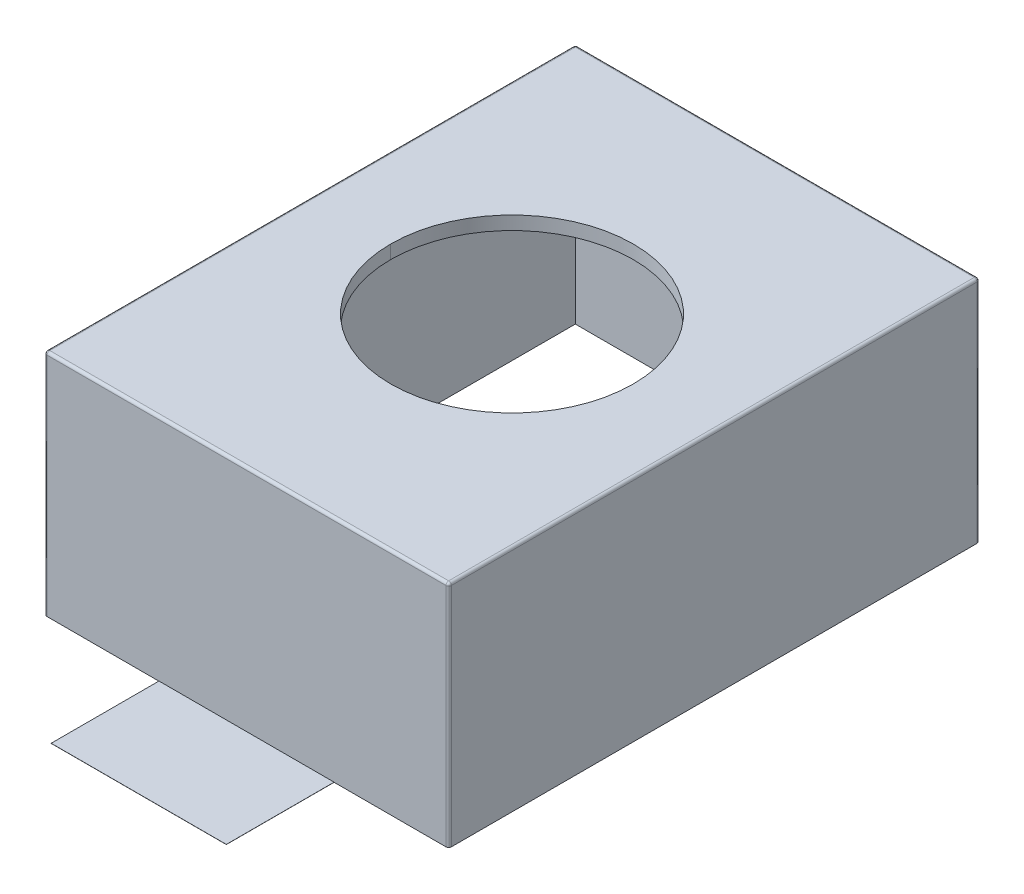
ISO-10303-21;
HEADER;
FILE_DESCRIPTION(('STEP AP214'),'2;1');
FILE_NAME('part.step','',(''),(''),'','','');
FILE_SCHEMA(('AUTOMOTIVE_DESIGN { 1 0 10303 214 1 1 1 1 }'));
ENDSEC;
DATA;
#1=APPLICATION_CONTEXT('core data for automotive mechanical design processes');
#2=APPLICATION_PROTOCOL_DEFINITION('international standard','automotive_design',2000,#1);
#3=PRODUCT_CONTEXT('',#1,'mechanical');
#4=PRODUCT('Part','Part','',(#3));
#5=PRODUCT_RELATED_PRODUCT_CATEGORY('part','',(#4));
#6=PRODUCT_DEFINITION_FORMATION('','',#4);
#7=PRODUCT_DEFINITION_CONTEXT('part definition',#1,'design');
#8=PRODUCT_DEFINITION('design','',#6,#7);
#9=PRODUCT_DEFINITION_SHAPE('','',#8);
#10=(LENGTH_UNIT() NAMED_UNIT(*) SI_UNIT(.MILLI.,.METRE.));
#11=(NAMED_UNIT(*) PLANE_ANGLE_UNIT() SI_UNIT($,.RADIAN.));
#12=(NAMED_UNIT(*) SI_UNIT($,.STERADIAN.) SOLID_ANGLE_UNIT());
#13=UNCERTAINTY_MEASURE_WITH_UNIT(LENGTH_MEASURE(1.E-05),#10,'distance_accuracy_value','');
#14=(GEOMETRIC_REPRESENTATION_CONTEXT(3) GLOBAL_UNCERTAINTY_ASSIGNED_CONTEXT((#13)) GLOBAL_UNIT_ASSIGNED_CONTEXT((#10,
#11,#12)) REPRESENTATION_CONTEXT('',''));
#15=CARTESIAN_POINT('',(0.,0.,0.));
#16=DIRECTION('',(0.,0.,1.));
#17=DIRECTION('',(1.,0.,0.));
#18=AXIS2_PLACEMENT_3D('',#15,#16,#17);
#19=CARTESIAN_POINT('',(6.25,1.651,18.66));
#20=DIRECTION('',(0.,-1.,0.));
#21=DIRECTION('',(0.,0.,-1.));
#22=AXIS2_PLACEMENT_3D('',#19,#20,#21);
#23=PLANE('',#22);
#24=DIRECTION('',(0.,0.,1.));
#25=VECTOR('',#24,1.);
#26=CARTESIAN_POINT('',(5.6,1.651,23.));
#27=LINE('',#26,#25);
#28=CARTESIAN_POINT('',(5.6,1.651,23.));
#29=VERTEX_POINT('',#28);
#30=CARTESIAN_POINT('',(5.6,1.651,23.8));
#31=VERTEX_POINT('',#30);
#32=EDGE_CURVE('E11',#29,#31,#27,.T.);
#33=ORIENTED_EDGE('',*,*,#32,.T.);
#34=DIRECTION('',(1.,0.,0.));
#35=VECTOR('',#34,1.);
#36=CARTESIAN_POINT('',(5.6,1.651,23.8));
#37=LINE('',#36,#35);
#38=CARTESIAN_POINT('',(6.9,1.651,23.8));
#39=VERTEX_POINT('',#38);
#40=EDGE_CURVE('E44',#31,#39,#37,.T.);
#41=ORIENTED_EDGE('',*,*,#40,.T.);
#42=DIRECTION('',(0.,0.,-1.));
#43=VECTOR('',#42,1.);
#44=CARTESIAN_POINT('',(6.9,1.651,23.8));
#45=LINE('',#44,#43);
#46=CARTESIAN_POINT('',(6.9,1.651,23.));
#47=VERTEX_POINT('',#46);
#48=EDGE_CURVE('E20',#39,#47,#45,.T.);
#49=ORIENTED_EDGE('',*,*,#48,.T.);
#50=DIRECTION('',(1.,0.,0.));
#51=VECTOR('',#50,1.);
#52=CARTESIAN_POINT('',(5.6,1.651,23.));
#53=LINE('',#52,#51);
#54=EDGE_CURVE('E466',#29,#47,#53,.T.);
#55=ORIENTED_EDGE('',*,*,#54,.F.);
#56=EDGE_LOOP('',(#33,#41,#49,#55));
#57=FACE_BOUND('',#56,.T.);
#58=ADVANCED_FACE('F17',(#57),#23,.F.);
#59=CARTESIAN_POINT('',(5.6,1.65,23.));
#60=DIRECTION('',(-1.,0.,0.));
#61=DIRECTION('',(0.,0.,1.));
#62=AXIS2_PLACEMENT_3D('',#59,#60,#61);
#63=PLANE('',#62);
#64=DIRECTION('',(0.,1.,0.));
#65=VECTOR('',#64,1.);
#66=CARTESIAN_POINT('',(5.6,1.65,23.8));
#67=LINE('',#66,#65);
#68=CARTESIAN_POINT('',(5.6,1.65,23.8));
#69=VERTEX_POINT('',#68);
#70=EDGE_CURVE('E26',#69,#31,#67,.T.);
#71=ORIENTED_EDGE('',*,*,#70,.T.);
#72=ORIENTED_EDGE('',*,*,#32,.F.);
#73=DIRECTION('',(0.,1.,0.));
#74=VECTOR('',#73,1.);
#75=CARTESIAN_POINT('',(5.6,1.65,23.));
#76=LINE('',#75,#74);
#77=CARTESIAN_POINT('',(5.6,1.65,23.));
#78=VERTEX_POINT('',#77);
#79=EDGE_CURVE('E430',#78,#29,#76,.T.);
#80=ORIENTED_EDGE('',*,*,#79,.F.);
#81=DIRECTION('',(0.,0.,1.));
#82=VECTOR('',#81,1.);
#83=CARTESIAN_POINT('',(5.6,1.65,23.));
#84=LINE('',#83,#82);
#85=EDGE_CURVE('E507',#78,#69,#84,.T.);
#86=ORIENTED_EDGE('',*,*,#85,.T.);
#87=EDGE_LOOP('',(#71,#72,#80,#86));
#88=FACE_BOUND('',#87,.T.);
#89=ADVANCED_FACE('F654',(#88),#63,.T.);
#90=CARTESIAN_POINT('',(5.6,1.65,23.8));
#91=DIRECTION('',(0.,0.,1.));
#92=DIRECTION('',(1.,0.,0.));
#93=AXIS2_PLACEMENT_3D('',#90,#91,#92);
#94=PLANE('',#93);
#95=DIRECTION('',(0.,1.,0.));
#96=VECTOR('',#95,1.);
#97=CARTESIAN_POINT('',(6.9,1.65,23.8));
#98=LINE('',#97,#96);
#99=CARTESIAN_POINT('',(6.9,1.65,23.8));
#100=VERTEX_POINT('',#99);
#101=EDGE_CURVE('E383',#100,#39,#98,.T.);
#102=ORIENTED_EDGE('',*,*,#101,.T.);
#103=ORIENTED_EDGE('',*,*,#40,.F.);
#104=ORIENTED_EDGE('',*,*,#70,.F.);
#105=DIRECTION('',(1.,0.,0.));
#106=VECTOR('',#105,1.);
#107=CARTESIAN_POINT('',(5.6,1.65,23.8));
#108=LINE('',#107,#106);
#109=EDGE_CURVE('E503',#69,#100,#108,.T.);
#110=ORIENTED_EDGE('',*,*,#109,.T.);
#111=EDGE_LOOP('',(#102,#103,#104,#110));
#112=FACE_BOUND('',#111,.T.);
#113=ADVANCED_FACE('F657',(#112),#94,.T.);
#114=CARTESIAN_POINT('',(6.9,1.65,23.8));
#115=DIRECTION('',(1.,0.,0.));
#116=DIRECTION('',(0.,1.,0.));
#117=AXIS2_PLACEMENT_3D('',#114,#115,#116);
#118=PLANE('',#117);
#119=DIRECTION('',(0.,-1.,0.));
#120=VECTOR('',#119,1.);
#121=CARTESIAN_POINT('',(6.9,1.651,23.));
#122=LINE('',#121,#120);
#123=CARTESIAN_POINT('',(6.9,1.65,23.));
#124=VERTEX_POINT('',#123);
#125=EDGE_CURVE('E425',#47,#124,#122,.T.);
#126=ORIENTED_EDGE('',*,*,#125,.F.);
#127=ORIENTED_EDGE('',*,*,#48,.F.);
#128=ORIENTED_EDGE('',*,*,#101,.F.);
#129=DIRECTION('',(0.,0.,-1.));
#130=VECTOR('',#129,1.);
#131=CARTESIAN_POINT('',(6.9,1.65,23.8));
#132=LINE('',#131,#130);
#133=EDGE_CURVE('E495',#100,#124,#132,.T.);
#134=ORIENTED_EDGE('',*,*,#133,.T.);
#135=EDGE_LOOP('',(#126,#127,#128,#134));
#136=FACE_BOUND('',#135,.T.);
#137=ADVANCED_FACE('F647',(#136),#118,.T.);
#138=CARTESIAN_POINT('',(4.85,1.65,19.06));
#139=DIRECTION('',(-1.,0.,0.));
#140=DIRECTION('',(0.,0.,1.));
#141=AXIS2_PLACEMENT_3D('',#138,#139,#140);
#142=PLANE('',#141);
#143=DIRECTION('',(0.,0.,1.));
#144=VECTOR('',#143,1.);
#145=CARTESIAN_POINT('',(4.85,1.65,19.16));
#146=LINE('',#145,#144);
#147=CARTESIAN_POINT('',(4.85,1.65,19.16));
#148=VERTEX_POINT('',#147);
#149=CARTESIAN_POINT('',(4.85,1.65,22.9));
#150=VERTEX_POINT('',#149);
#151=EDGE_CURVE('E519',#148,#150,#146,.T.);
#152=ORIENTED_EDGE('',*,*,#151,.F.);
#153=DIRECTION('',(0.,1.,0.));
#154=VECTOR('',#153,1.);
#155=CARTESIAN_POINT('',(4.85,1.65,19.16));
#156=LINE('',#155,#154);
#157=CARTESIAN_POINT('',(4.85,3.25,19.16));
#158=VERTEX_POINT('',#157);
#159=EDGE_CURVE('E636',#148,#158,#156,.T.);
#160=ORIENTED_EDGE('',*,*,#159,.T.);
#161=DIRECTION('',(0.,0.,1.));
#162=VECTOR('',#161,1.);
#163=CARTESIAN_POINT('',(4.85,3.25,19.16));
#164=LINE('',#163,#162);
#165=CARTESIAN_POINT('',(4.85,3.25,22.9));
#166=VERTEX_POINT('',#165);
#167=EDGE_CURVE('E482',#158,#166,#164,.T.);
#168=ORIENTED_EDGE('',*,*,#167,.T.);
#169=DIRECTION('',(0.,1.,0.));
#170=VECTOR('',#169,1.);
#171=CARTESIAN_POINT('',(4.85,1.65,22.9));
#172=LINE('',#171,#170);
#173=EDGE_CURVE('E404',#150,#166,#172,.T.);
#174=ORIENTED_EDGE('',*,*,#173,.F.);
#175=EDGE_LOOP('',(#152,#160,#168,#174));
#176=FACE_BOUND('',#175,.T.);
#177=ADVANCED_FACE('F753',(#176),#142,.F.);
#178=CARTESIAN_POINT('',(7.75,1.65,19.16));
#179=DIRECTION('',(0.,0.,-1.));
#180=DIRECTION('',(0.,-1.,0.));
#181=AXIS2_PLACEMENT_3D('',#178,#179,#180);
#182=PLANE('',#181);
#183=DIRECTION('',(0.,1.,0.));
#184=VECTOR('',#183,1.);
#185=CARTESIAN_POINT('',(7.65,1.65,19.16));
#186=LINE('',#185,#184);
#187=CARTESIAN_POINT('',(7.65,1.65,19.16));
#188=VERTEX_POINT('',#187);
#189=CARTESIAN_POINT('',(7.65,3.25,19.16));
#190=VERTEX_POINT('',#189);
#191=EDGE_CURVE('E403',#188,#190,#186,.T.);
#192=ORIENTED_EDGE('',*,*,#191,.T.);
#193=DIRECTION('',(-1.,0.,0.));
#194=VECTOR('',#193,1.);
#195=CARTESIAN_POINT('',(7.65,3.25,19.16));
#196=LINE('',#195,#194);
#197=EDGE_CURVE('E477',#190,#158,#196,.T.);
#198=ORIENTED_EDGE('',*,*,#197,.T.);
#199=ORIENTED_EDGE('',*,*,#159,.F.);
#200=DIRECTION('',(-1.,0.,0.));
#201=VECTOR('',#200,1.);
#202=CARTESIAN_POINT('',(7.65,1.65,19.16));
#203=LINE('',#202,#201);
#204=EDGE_CURVE('E426',#188,#148,#203,.T.);
#205=ORIENTED_EDGE('',*,*,#204,.F.);
#206=EDGE_LOOP('',(#192,#198,#199,#205));
#207=FACE_BOUND('',#206,.T.);
#208=ADVANCED_FACE('F756',(#207),#182,.F.);
#209=CARTESIAN_POINT('',(7.65,1.65,23.));
#210=DIRECTION('',(1.,0.,0.));
#211=DIRECTION('',(0.,1.,0.));
#212=AXIS2_PLACEMENT_3D('',#209,#210,#211);
#213=PLANE('',#212);
#214=DIRECTION('',(0.,0.,-1.));
#215=VECTOR('',#214,1.);
#216=CARTESIAN_POINT('',(7.65,1.65,22.9));
#217=LINE('',#216,#215);
#218=CARTESIAN_POINT('',(7.65,1.65,22.9));
#219=VERTEX_POINT('',#218);
#220=EDGE_CURVE('E431',#219,#188,#217,.T.);
#221=ORIENTED_EDGE('',*,*,#220,.F.);
#222=DIRECTION('',(0.,1.,0.));
#223=VECTOR('',#222,1.);
#224=CARTESIAN_POINT('',(7.65,1.65,22.9));
#225=LINE('',#224,#223);
#226=CARTESIAN_POINT('',(7.65,3.25,22.9));
#227=VERTEX_POINT('',#226);
#228=EDGE_CURVE('E400',#219,#227,#225,.T.);
#229=ORIENTED_EDGE('',*,*,#228,.T.);
#230=DIRECTION('',(0.,0.,-1.));
#231=VECTOR('',#230,1.);
#232=CARTESIAN_POINT('',(7.65,3.25,22.9));
#233=LINE('',#232,#231);
#234=EDGE_CURVE('E481',#227,#190,#233,.T.);
#235=ORIENTED_EDGE('',*,*,#234,.T.);
#236=ORIENTED_EDGE('',*,*,#191,.F.);
#237=EDGE_LOOP('',(#221,#229,#235,#236));
#238=FACE_BOUND('',#237,.T.);
#239=ADVANCED_FACE('F759',(#238),#213,.F.);
#240=CARTESIAN_POINT('',(4.75,1.65,22.9));
#241=DIRECTION('',(0.,0.,1.));
#242=DIRECTION('',(1.,0.,0.));
#243=AXIS2_PLACEMENT_3D('',#240,#241,#242);
#244=PLANE('',#243);
#245=ORIENTED_EDGE('',*,*,#173,.T.);
#246=DIRECTION('',(1.,0.,0.));
#247=VECTOR('',#246,1.);
#248=CARTESIAN_POINT('',(4.85,3.25,22.9));
#249=LINE('',#248,#247);
#250=EDGE_CURVE('E496',#166,#227,#249,.T.);
#251=ORIENTED_EDGE('',*,*,#250,.T.);
#252=ORIENTED_EDGE('',*,*,#228,.F.);
#253=DIRECTION('',(1.,0.,0.));
#254=VECTOR('',#253,1.);
#255=CARTESIAN_POINT('',(4.85,1.65,22.9));
#256=LINE('',#255,#254);
#257=EDGE_CURVE('E523',#150,#219,#256,.T.);
#258=ORIENTED_EDGE('',*,*,#257,.F.);
#259=EDGE_LOOP('',(#245,#251,#252,#258));
#260=FACE_BOUND('',#259,.T.);
#261=ADVANCED_FACE('F761',(#260),#244,.F.);
#262=CARTESIAN_POINT('',(6.25,3.25,21.03));
#263=DIRECTION('',(0.,1.,0.));
#264=DIRECTION('',(1.,0.,0.));
#265=AXIS2_PLACEMENT_3D('',#262,#263,#264);
#266=PLANE('',#265);
#267=CARTESIAN_POINT('',(6.25,3.25,21.03));
#268=DIRECTION('',(0.,-1.,0.));
#269=DIRECTION('',(1.,0.,0.));
#270=AXIS2_PLACEMENT_3D('',#267,#268,#269);
#271=CIRCLE('',#270,0.9);
#272=CARTESIAN_POINT('',(7.15,3.25,21.03));
#273=VERTEX_POINT('',#272);
#274=CARTESIAN_POINT('',(5.35,3.25,21.03));
#275=VERTEX_POINT('',#274);
#276=EDGE_CURVE('E546',#273,#275,#271,.T.);
#277=ORIENTED_EDGE('',*,*,#276,.F.);
#278=CARTESIAN_POINT('',(6.25,3.25,21.03));
#279=DIRECTION('',(0.,-1.,0.));
#280=DIRECTION('',(-1.,0.,0.));
#281=AXIS2_PLACEMENT_3D('',#278,#279,#280);
#282=CIRCLE('',#281,0.9);
#283=EDGE_CURVE('E585',#275,#273,#282,.T.);
#284=ORIENTED_EDGE('',*,*,#283,.F.);
#285=EDGE_LOOP('',(#277,#284));
#286=FACE_BOUND('',#285,.T.);
#287=ORIENTED_EDGE('',*,*,#167,.F.);
#288=ORIENTED_EDGE('',*,*,#197,.F.);
#289=ORIENTED_EDGE('',*,*,#234,.F.);
#290=ORIENTED_EDGE('',*,*,#250,.F.);
#291=EDGE_LOOP('',(#287,#288,#289,#290));
#292=FACE_BOUND('',#291,.T.);
#293=ADVANCED_FACE('F764',(#286,#292),#266,.F.);
#294=CARTESIAN_POINT('',(6.25,3.35,21.03));
#295=DIRECTION('',(0.,-1.,0.));
#296=DIRECTION('',(-1.,0.,0.));
#297=AXIS2_PLACEMENT_3D('',#294,#295,#296);
#298=CYLINDRICAL_SURFACE('',#297,0.9);
#299=ORIENTED_EDGE('',*,*,#283,.T.);
#300=DIRECTION('',(0.,-1.,0.));
#301=VECTOR('',#300,1.);
#302=CARTESIAN_POINT('',(7.15,3.35,21.03));
#303=LINE('',#302,#301);
#304=CARTESIAN_POINT('',(7.15,3.35,21.03));
#305=VERTEX_POINT('',#304);
#306=EDGE_CURVE('E539',#305,#273,#303,.T.);
#307=ORIENTED_EDGE('',*,*,#306,.F.);
#308=CARTESIAN_POINT('',(6.25,3.35,21.03));
#309=DIRECTION('',(0.,1.,0.));
#310=DIRECTION('',(1.,0.,0.));
#311=AXIS2_PLACEMENT_3D('',#308,#309,#310);
#312=CIRCLE('',#311,0.9);
#313=CARTESIAN_POINT('',(5.35,3.35,21.03));
#314=VERTEX_POINT('',#313);
#315=EDGE_CURVE('E306',#305,#314,#312,.T.);
#316=ORIENTED_EDGE('',*,*,#315,.T.);
#317=DIRECTION('',(0.,1.,0.));
#318=VECTOR('',#317,1.);
#319=CARTESIAN_POINT('',(5.35,3.25,21.03));
#320=LINE('',#319,#318);
#321=EDGE_CURVE('E550',#275,#314,#320,.T.);
#322=ORIENTED_EDGE('',*,*,#321,.F.);
#323=EDGE_LOOP('',(#299,#307,#316,#322));
#324=FACE_BOUND('',#323,.T.);
#325=ADVANCED_FACE('F768',(#324),#298,.F.);
#326=CARTESIAN_POINT('',(6.25,3.35,21.03));
#327=DIRECTION('',(0.,-1.,0.));
#328=DIRECTION('',(-1.,0.,0.));
#329=AXIS2_PLACEMENT_3D('',#326,#327,#328);
#330=CYLINDRICAL_SURFACE('',#329,0.9);
#331=CARTESIAN_POINT('',(6.25,3.35,21.03));
#332=DIRECTION('',(0.,1.,0.));
#333=DIRECTION('',(-1.,0.,0.));
#334=AXIS2_PLACEMENT_3D('',#331,#332,#333);
#335=CIRCLE('',#334,0.9);
#336=EDGE_CURVE('E511',#314,#305,#335,.T.);
#337=ORIENTED_EDGE('',*,*,#336,.T.);
#338=ORIENTED_EDGE('',*,*,#306,.T.);
#339=ORIENTED_EDGE('',*,*,#276,.T.);
#340=ORIENTED_EDGE('',*,*,#321,.T.);
#341=EDGE_LOOP('',(#337,#338,#339,#340));
#342=FACE_BOUND('',#341,.T.);
#343=ADVANCED_FACE('F772',(#342),#330,.F.);
#344=CARTESIAN_POINT('',(6.25,3.35,21.03));
#345=DIRECTION('',(0.,1.,0.));
#346=DIRECTION('',(1.,0.,0.));
#347=AXIS2_PLACEMENT_3D('',#344,#345,#346);
#348=PLANE('',#347);
#349=ORIENTED_EDGE('',*,*,#315,.F.);
#350=ORIENTED_EDGE('',*,*,#336,.F.);
#351=EDGE_LOOP('',(#349,#350));
#352=FACE_BOUND('',#351,.T.);
#353=DIRECTION('',(1.,0.,0.));
#354=VECTOR('',#353,1.);
#355=CARTESIAN_POINT('',(4.77,3.35,22.98));
#356=LINE('',#355,#354);
#357=CARTESIAN_POINT('',(4.77,3.35,22.98));
#358=VERTEX_POINT('',#357);
#359=CARTESIAN_POINT('',(7.73,3.35,22.98));
#360=VERTEX_POINT('',#359);
#361=EDGE_CURVE('E553',#358,#360,#356,.T.);
#362=ORIENTED_EDGE('',*,*,#361,.T.);
#363=DIRECTION('',(0.,0.,-1.));
#364=VECTOR('',#363,1.);
#365=CARTESIAN_POINT('',(7.73,3.35,22.98));
#366=LINE('',#365,#364);
#367=CARTESIAN_POINT('',(7.73,3.35,19.08));
#368=VERTEX_POINT('',#367);
#369=EDGE_CURVE('E317',#360,#368,#366,.T.);
#370=ORIENTED_EDGE('',*,*,#369,.T.);
#371=DIRECTION('',(-1.,0.,0.));
#372=VECTOR('',#371,1.);
#373=CARTESIAN_POINT('',(7.73,3.35,19.08));
#374=LINE('',#373,#372);
#375=CARTESIAN_POINT('',(4.77,3.35,19.08));
#376=VERTEX_POINT('',#375);
#377=EDGE_CURVE('E580',#368,#376,#374,.T.);
#378=ORIENTED_EDGE('',*,*,#377,.T.);
#379=DIRECTION('',(0.,0.,1.));
#380=VECTOR('',#379,1.);
#381=CARTESIAN_POINT('',(4.77,3.35,19.08));
#382=LINE('',#381,#380);
#383=EDGE_CURVE('E368',#376,#358,#382,.T.);
#384=ORIENTED_EDGE('',*,*,#383,.T.);
#385=EDGE_LOOP('',(#362,#370,#378,#384));
#386=FACE_BOUND('',#385,.T.);
#387=ADVANCED_FACE('F716',(#352,#386),#348,.T.);
#388=CARTESIAN_POINT('',(7.73,1.65,22.98));
#389=DIRECTION('',(0.,1.,0.));
#390=DIRECTION('',(0.707106781186548,0.,0.707106781186548));
#391=AXIS2_PLACEMENT_3D('',#388,#389,#390);
#392=CYLINDRICAL_SURFACE('',#391,0.02);
#393=DIRECTION('',(0.,-1.,0.));
#394=VECTOR('',#393,1.);
#395=CARTESIAN_POINT('',(7.75,3.33,22.98));
#396=LINE('',#395,#394);
#397=CARTESIAN_POINT('',(7.75,3.33,22.98));
#398=VERTEX_POINT('',#397);
#399=CARTESIAN_POINT('',(7.75,1.65,22.98));
#400=VERTEX_POINT('',#399);
#401=EDGE_CURVE('E294',#398,#400,#396,.T.);
#402=ORIENTED_EDGE('',*,*,#401,.F.);
#403=CARTESIAN_POINT('',(7.73,3.33,22.98));
#404=DIRECTION('',(0.,-1.,0.));
#405=DIRECTION('',(1.,0.,0.));
#406=AXIS2_PLACEMENT_3D('',#403,#404,#405);
#407=CIRCLE('',#406,0.02);
#408=CARTESIAN_POINT('',(7.744142135624,3.33,22.99414213562));
#409=VERTEX_POINT('',#408);
#410=EDGE_CURVE('E298',#398,#409,#407,.T.);
#411=ORIENTED_EDGE('',*,*,#410,.T.);
#412=CARTESIAN_POINT('',(7.73,3.33,22.98));
#413=DIRECTION('',(0.,-1.,0.));
#414=DIRECTION('',(0.707106781186498,0.,0.707106781186598));
#415=AXIS2_PLACEMENT_3D('',#412,#413,#414);
#416=CIRCLE('',#415,0.02);
#417=CARTESIAN_POINT('',(7.73,3.33,23.));
#418=VERTEX_POINT('',#417);
#419=EDGE_CURVE('E330',#409,#418,#416,.T.);
#420=ORIENTED_EDGE('',*,*,#419,.T.);
#421=DIRECTION('',(0.,1.,0.));
#422=VECTOR('',#421,1.);
#423=CARTESIAN_POINT('',(7.73,1.65,23.));
#424=LINE('',#423,#422);
#425=CARTESIAN_POINT('',(7.73,1.65,23.));
#426=VERTEX_POINT('',#425);
#427=EDGE_CURVE('E420',#426,#418,#424,.T.);
#428=ORIENTED_EDGE('',*,*,#427,.F.);
#429=CARTESIAN_POINT('',(7.73,1.65,22.98));
#430=DIRECTION('',(0.,1.,0.));
#431=DIRECTION('',(0.,0.,1.));
#432=AXIS2_PLACEMENT_3D('',#429,#430,#431);
#433=CIRCLE('',#432,0.02);
#434=CARTESIAN_POINT('',(7.744142135624,1.65,22.99414213562));
#435=VERTEX_POINT('',#434);
#436=EDGE_CURVE('E485',#426,#435,#433,.T.);
#437=ORIENTED_EDGE('',*,*,#436,.T.);
#438=CARTESIAN_POINT('',(7.73,1.65,22.98));
#439=DIRECTION('',(0.,1.,0.));
#440=DIRECTION('',(0.707106781186498,0.,0.707106781186598));
#441=AXIS2_PLACEMENT_3D('',#438,#439,#440);
#442=CIRCLE('',#441,0.02);
#443=EDGE_CURVE('E301',#435,#400,#442,.T.);
#444=ORIENTED_EDGE('',*,*,#443,.T.);
#445=EDGE_LOOP('',(#402,#411,#420,#428,#437,#444));
#446=FACE_BOUND('',#445,.T.);
#447=ADVANCED_FACE('F296',(#446),#392,.T.);
#448=CARTESIAN_POINT('',(7.75,1.65,23.));
#449=DIRECTION('',(1.,0.,0.));
#450=DIRECTION('',(0.,1.,0.));
#451=AXIS2_PLACEMENT_3D('',#448,#449,#450);
#452=PLANE('',#451);
#453=DIRECTION('',(0.,0.,-1.));
#454=VECTOR('',#453,1.);
#455=CARTESIAN_POINT('',(7.75,1.65,22.98));
#456=LINE('',#455,#454);
#457=CARTESIAN_POINT('',(7.75,1.65,19.08));
#458=VERTEX_POINT('',#457);
#459=EDGE_CURVE('E452',#400,#458,#456,.T.);
#460=ORIENTED_EDGE('',*,*,#459,.T.);
#461=DIRECTION('',(0.,1.,0.));
#462=VECTOR('',#461,1.);
#463=CARTESIAN_POINT('',(7.75,1.65,19.08));
#464=LINE('',#463,#462);
#465=CARTESIAN_POINT('',(7.75,3.33,19.08));
#466=VERTEX_POINT('',#465);
#467=EDGE_CURVE('E307',#458,#466,#464,.T.);
#468=ORIENTED_EDGE('',*,*,#467,.T.);
#469=DIRECTION('',(0.,0.,1.));
#470=VECTOR('',#469,1.);
#471=CARTESIAN_POINT('',(7.75,3.33,19.08));
#472=LINE('',#471,#470);
#473=EDGE_CURVE('E310',#466,#398,#472,.T.);
#474=ORIENTED_EDGE('',*,*,#473,.T.);
#475=ORIENTED_EDGE('',*,*,#401,.T.);
#476=EDGE_LOOP('',(#460,#468,#474,#475));
#477=FACE_BOUND('',#476,.T.);
#478=ADVANCED_FACE('F312',(#477),#452,.T.);
#479=CARTESIAN_POINT('',(7.73,1.65,19.08));
#480=DIRECTION('',(0.,1.,0.));
#481=DIRECTION('',(0.707106781186548,0.,-0.707106781186548));
#482=AXIS2_PLACEMENT_3D('',#479,#480,#481);
#483=CYLINDRICAL_SURFACE('',#482,0.02);
#484=DIRECTION('',(0.,-1.,0.));
#485=VECTOR('',#484,1.);
#486=CARTESIAN_POINT('',(7.73,3.33,19.06));
#487=LINE('',#486,#485);
#488=CARTESIAN_POINT('',(7.73,3.33,19.06));
#489=VERTEX_POINT('',#488);
#490=CARTESIAN_POINT('',(7.73,1.65,19.06));
#491=VERTEX_POINT('',#490);
#492=EDGE_CURVE('E461',#489,#491,#487,.T.);
#493=ORIENTED_EDGE('',*,*,#492,.F.);
#494=CARTESIAN_POINT('',(7.73,3.33,19.08));
#495=DIRECTION('',(0.,-1.,0.));
#496=DIRECTION('',(1.33226762955E-13,0.,-1.));
#497=AXIS2_PLACEMENT_3D('',#494,#495,#496);
#498=CIRCLE('',#497,0.02);
#499=CARTESIAN_POINT('',(7.744142135624,3.33,19.06585786438));
#500=VERTEX_POINT('',#499);
#501=EDGE_CURVE('E572',#489,#500,#498,.T.);
#502=ORIENTED_EDGE('',*,*,#501,.T.);
#503=CARTESIAN_POINT('',(7.73,3.33,19.08));
#504=DIRECTION('',(0.,-1.,0.));
#505=DIRECTION('',(0.707106781186498,0.,-0.707106781186598));
#506=AXIS2_PLACEMENT_3D('',#503,#504,#505);
#507=CIRCLE('',#506,0.02);
#508=EDGE_CURVE('E567',#500,#466,#507,.T.);
#509=ORIENTED_EDGE('',*,*,#508,.T.);
#510=ORIENTED_EDGE('',*,*,#467,.F.);
#511=CARTESIAN_POINT('',(7.73,1.65,19.08));
#512=DIRECTION('',(0.,1.,0.));
#513=DIRECTION('',(1.,0.,0.));
#514=AXIS2_PLACEMENT_3D('',#511,#512,#513);
#515=CIRCLE('',#514,0.02);
#516=CARTESIAN_POINT('',(7.744142135624,1.65,19.06585786438));
#517=VERTEX_POINT('',#516);
#518=EDGE_CURVE('E347',#458,#517,#515,.T.);
#519=ORIENTED_EDGE('',*,*,#518,.T.);
#520=CARTESIAN_POINT('',(7.73,1.65,19.08));
#521=DIRECTION('',(0.,1.,0.));
#522=DIRECTION('',(0.707106781186498,0.,-0.707106781186598));
#523=AXIS2_PLACEMENT_3D('',#520,#521,#522);
#524=CIRCLE('',#523,0.02);
#525=EDGE_CURVE('E343',#517,#491,#524,.T.);
#526=ORIENTED_EDGE('',*,*,#525,.T.);
#527=EDGE_LOOP('',(#493,#502,#509,#510,#519,#526));
#528=FACE_BOUND('',#527,.T.);
#529=ADVANCED_FACE('F706',(#528),#483,.T.);
#530=CARTESIAN_POINT('',(6.25,1.651,18.66));
#531=DIRECTION('',(0.,-1.,0.));
#532=DIRECTION('',(0.,0.,-1.));
#533=AXIS2_PLACEMENT_3D('',#530,#531,#532);
#534=PLANE('',#533);
#535=DIRECTION('',(0.,0.,-1.));
#536=VECTOR('',#535,1.);
#537=CARTESIAN_POINT('',(6.9,1.651,19.06));
#538=LINE('',#537,#536);
#539=CARTESIAN_POINT('',(6.9,1.651,19.06));
#540=VERTEX_POINT('',#539);
#541=CARTESIAN_POINT('',(6.9,1.651,18.26));
#542=VERTEX_POINT('',#541);
#543=EDGE_CURVE('E619',#540,#542,#538,.T.);
#544=ORIENTED_EDGE('',*,*,#543,.T.);
#545=DIRECTION('',(-1.,0.,0.));
#546=VECTOR('',#545,1.);
#547=CARTESIAN_POINT('',(6.9,1.651,18.26));
#548=LINE('',#547,#546);
#549=CARTESIAN_POINT('',(5.6,1.651,18.26));
#550=VERTEX_POINT('',#549);
#551=EDGE_CURVE('E612',#542,#550,#548,.T.);
#552=ORIENTED_EDGE('',*,*,#551,.T.);
#553=DIRECTION('',(0.,0.,1.));
#554=VECTOR('',#553,1.);
#555=CARTESIAN_POINT('',(5.6,1.651,18.26));
#556=LINE('',#555,#554);
#557=CARTESIAN_POINT('',(5.6,1.651,19.06));
#558=VERTEX_POINT('',#557);
#559=EDGE_CURVE('E387',#550,#558,#556,.T.);
#560=ORIENTED_EDGE('',*,*,#559,.T.);
#561=DIRECTION('',(-1.,0.,0.));
#562=VECTOR('',#561,1.);
#563=CARTESIAN_POINT('',(6.9,1.651,19.06));
#564=LINE('',#563,#562);
#565=EDGE_CURVE('E388',#540,#558,#564,.T.);
#566=ORIENTED_EDGE('',*,*,#565,.F.);
#567=EDGE_LOOP('',(#544,#552,#560,#566));
#568=FACE_BOUND('',#567,.T.);
#569=ADVANCED_FACE('F784',(#568),#534,.F.);
#570=CARTESIAN_POINT('',(6.9,1.65,19.06));
#571=DIRECTION('',(1.,0.,0.));
#572=DIRECTION('',(0.,1.,0.));
#573=AXIS2_PLACEMENT_3D('',#570,#571,#572);
#574=PLANE('',#573);
#575=DIRECTION('',(0.,1.,0.));
#576=VECTOR('',#575,1.);
#577=CARTESIAN_POINT('',(6.9,1.65,18.26));
#578=LINE('',#577,#576);
#579=CARTESIAN_POINT('',(6.9,1.65,18.26));
#580=VERTEX_POINT('',#579);
#581=EDGE_CURVE('E615',#580,#542,#578,.T.);
#582=ORIENTED_EDGE('',*,*,#581,.T.);
#583=ORIENTED_EDGE('',*,*,#543,.F.);
#584=DIRECTION('',(0.,1.,0.));
#585=VECTOR('',#584,1.);
#586=CARTESIAN_POINT('',(6.9,1.65,19.06));
#587=LINE('',#586,#585);
#588=CARTESIAN_POINT('',(6.9,1.65,19.06));
#589=VERTEX_POINT('',#588);
#590=EDGE_CURVE('E417',#589,#540,#587,.T.);
#591=ORIENTED_EDGE('',*,*,#590,.F.);
#592=DIRECTION('',(0.,0.,-1.));
#593=VECTOR('',#592,1.);
#594=CARTESIAN_POINT('',(6.9,1.65,19.06));
#595=LINE('',#594,#593);
#596=EDGE_CURVE('E447',#589,#580,#595,.T.);
#597=ORIENTED_EDGE('',*,*,#596,.T.);
#598=EDGE_LOOP('',(#582,#583,#591,#597));
#599=FACE_BOUND('',#598,.T.);
#600=ADVANCED_FACE('F703',(#599),#574,.T.);
#601=CARTESIAN_POINT('',(6.9,1.65,18.26));
#602=DIRECTION('',(0.,0.,-1.));
#603=DIRECTION('',(0.,-1.,0.));
#604=AXIS2_PLACEMENT_3D('',#601,#602,#603);
#605=PLANE('',#604);
#606=DIRECTION('',(0.,1.,0.));
#607=VECTOR('',#606,1.);
#608=CARTESIAN_POINT('',(5.6,1.65,18.26));
#609=LINE('',#608,#607);
#610=CARTESIAN_POINT('',(5.6,1.65,18.26));
#611=VERTEX_POINT('',#610);
#612=EDGE_CURVE('E608',#611,#550,#609,.T.);
#613=ORIENTED_EDGE('',*,*,#612,.T.);
#614=ORIENTED_EDGE('',*,*,#551,.F.);
#615=ORIENTED_EDGE('',*,*,#581,.F.);
#616=DIRECTION('',(-1.,0.,0.));
#617=VECTOR('',#616,1.);
#618=CARTESIAN_POINT('',(6.9,1.65,18.26));
#619=LINE('',#618,#617);
#620=EDGE_CURVE('E443',#580,#611,#619,.T.);
#621=ORIENTED_EDGE('',*,*,#620,.T.);
#622=EDGE_LOOP('',(#613,#614,#615,#621));
#623=FACE_BOUND('',#622,.T.);
#624=ADVANCED_FACE('F698',(#623),#605,.T.);
#625=CARTESIAN_POINT('',(5.6,1.65,18.26));
#626=DIRECTION('',(-1.,0.,0.));
#627=DIRECTION('',(0.,0.,1.));
#628=AXIS2_PLACEMENT_3D('',#625,#626,#627);
#629=PLANE('',#628);
#630=DIRECTION('',(0.,-1.,0.));
#631=VECTOR('',#630,1.);
#632=CARTESIAN_POINT('',(5.6,1.651,19.06));
#633=LINE('',#632,#631);
#634=CARTESIAN_POINT('',(5.6,1.65,19.06));
#635=VERTEX_POINT('',#634);
#636=EDGE_CURVE('E384',#558,#635,#633,.T.);
#637=ORIENTED_EDGE('',*,*,#636,.F.);
#638=ORIENTED_EDGE('',*,*,#559,.F.);
#639=ORIENTED_EDGE('',*,*,#612,.F.);
#640=DIRECTION('',(0.,0.,1.));
#641=VECTOR('',#640,1.);
#642=CARTESIAN_POINT('',(5.6,1.65,18.26));
#643=LINE('',#642,#641);
#644=EDGE_CURVE('E448',#611,#635,#643,.T.);
#645=ORIENTED_EDGE('',*,*,#644,.T.);
#646=EDGE_LOOP('',(#637,#638,#639,#645));
#647=FACE_BOUND('',#646,.T.);
#648=ADVANCED_FACE('F695',(#647),#629,.T.);
#649=CARTESIAN_POINT('',(7.75,1.65,19.06));
#650=DIRECTION('',(0.,0.,-1.));
#651=DIRECTION('',(0.,-1.,0.));
#652=AXIS2_PLACEMENT_3D('',#649,#650,#651);
#653=PLANE('',#652);
#654=DIRECTION('',(1.,0.,0.));
#655=VECTOR('',#654,1.);
#656=CARTESIAN_POINT('',(4.77,3.33,19.06));
#657=LINE('',#656,#655);
#658=CARTESIAN_POINT('',(4.77,3.33,19.06));
#659=VERTEX_POINT('',#658);
#660=EDGE_CURVE('E592',#659,#489,#657,.T.);
#661=ORIENTED_EDGE('',*,*,#660,.T.);
#662=ORIENTED_EDGE('',*,*,#492,.T.);
#663=DIRECTION('',(-1.,0.,0.));
#664=VECTOR('',#663,1.);
#665=CARTESIAN_POINT('',(7.73,1.65,19.06));
#666=LINE('',#665,#664);
#667=EDGE_CURVE('E348',#491,#589,#666,.T.);
#668=ORIENTED_EDGE('',*,*,#667,.T.);
#669=ORIENTED_EDGE('',*,*,#590,.T.);
#670=ORIENTED_EDGE('',*,*,#565,.T.);
#671=ORIENTED_EDGE('',*,*,#636,.T.);
#672=DIRECTION('',(-1.,0.,0.));
#673=VECTOR('',#672,1.);
#674=CARTESIAN_POINT('',(5.6,1.65,19.06));
#675=LINE('',#674,#673);
#676=CARTESIAN_POINT('',(4.77,1.65,19.06));
#677=VERTEX_POINT('',#676);
#678=EDGE_CURVE('E451',#635,#677,#675,.T.);
#679=ORIENTED_EDGE('',*,*,#678,.T.);
#680=DIRECTION('',(0.,1.,0.));
#681=VECTOR('',#680,1.);
#682=CARTESIAN_POINT('',(4.77,1.65,19.06));
#683=LINE('',#682,#681);
#684=EDGE_CURVE('E392',#677,#659,#683,.T.);
#685=ORIENTED_EDGE('',*,*,#684,.T.);
#686=EDGE_LOOP('',(#661,#662,#668,#669,#670,#671,#679,#685));
#687=FACE_BOUND('',#686,.T.);
#688=ADVANCED_FACE('F690',(#687),#653,.T.);
#689=CARTESIAN_POINT('',(4.77,1.65,19.08));
#690=DIRECTION('',(0.,1.,0.));
#691=DIRECTION('',(-0.707106781186548,0.,-0.707106781186548));
#692=AXIS2_PLACEMENT_3D('',#689,#690,#691);
#693=CYLINDRICAL_SURFACE('',#692,0.02);
#694=DIRECTION('',(0.,-1.,0.));
#695=VECTOR('',#694,1.);
#696=CARTESIAN_POINT('',(4.75,3.33,19.08));
#697=LINE('',#696,#695);
#698=CARTESIAN_POINT('',(4.75,3.33,19.08));
#699=VERTEX_POINT('',#698);
#700=CARTESIAN_POINT('',(4.75,1.65,19.08));
#701=VERTEX_POINT('',#700);
#702=EDGE_CURVE('E349',#699,#701,#697,.T.);
#703=ORIENTED_EDGE('',*,*,#702,.F.);
#704=CARTESIAN_POINT('',(4.77,3.33,19.08));
#705=DIRECTION('',(0.,-1.,0.));
#706=DIRECTION('',(-1.,0.,0.));
#707=AXIS2_PLACEMENT_3D('',#704,#705,#706);
#708=CIRCLE('',#707,0.02);
#709=CARTESIAN_POINT('',(4.755857864376,3.33,19.06585786438));
#710=VERTEX_POINT('',#709);
#711=EDGE_CURVE('E389',#699,#710,#708,.T.);
#712=ORIENTED_EDGE('',*,*,#711,.T.);
#713=CARTESIAN_POINT('',(4.77,3.33,19.08));
#714=DIRECTION('',(0.,-1.,0.));
#715=DIRECTION('',(-0.707106781186498,0.,-0.707106781186598));
#716=AXIS2_PLACEMENT_3D('',#713,#714,#715);
#717=CIRCLE('',#716,0.02);
#718=EDGE_CURVE('E393',#710,#659,#717,.T.);
#719=ORIENTED_EDGE('',*,*,#718,.T.);
#720=ORIENTED_EDGE('',*,*,#684,.F.);
#721=CARTESIAN_POINT('',(4.77,1.65,19.08));
#722=DIRECTION('',(0.,1.,0.));
#723=DIRECTION('',(0.,0.,-1.));
#724=AXIS2_PLACEMENT_3D('',#721,#722,#723);
#725=CIRCLE('',#724,0.02);
#726=CARTESIAN_POINT('',(4.755857864376,1.65,19.06585786438));
#727=VERTEX_POINT('',#726);
#728=EDGE_CURVE('E442',#677,#727,#725,.T.);
#729=ORIENTED_EDGE('',*,*,#728,.T.);
#730=CARTESIAN_POINT('',(4.77,1.65,19.08));
#731=DIRECTION('',(0.,1.,0.));
#732=DIRECTION('',(-0.707106781186498,0.,-0.707106781186598));
#733=AXIS2_PLACEMENT_3D('',#730,#731,#732);
#734=CIRCLE('',#733,0.02);
#735=EDGE_CURVE('E439',#727,#701,#734,.T.);
#736=ORIENTED_EDGE('',*,*,#735,.T.);
#737=EDGE_LOOP('',(#703,#712,#719,#720,#729,#736));
#738=FACE_BOUND('',#737,.T.);
#739=ADVANCED_FACE('F683',(#738),#693,.T.);
#740=CARTESIAN_POINT('',(4.77,3.33,19.08));
#741=DIRECTION('',(-0.408248290463813,-0.816496580927726,-0.408248290463913));
#742=DIRECTION('',(-0.577350269189626,0.577350269189626,-0.577350269189626));
#743=AXIS2_PLACEMENT_3D('',#740,#741,#742);
#744=SPHERICAL_SURFACE('',#743,0.02);
#745=CARTESIAN_POINT('',(4.77,3.33,19.08));
#746=DIRECTION('',(1.,0.,0.));
#747=DIRECTION('',(0.,0.,-1.));
#748=AXIS2_PLACEMENT_3D('',#745,#746,#747);
#749=CIRCLE('',#748,0.02);
#750=CARTESIAN_POINT('',(4.77,3.344142135624,19.06585786438));
#751=VERTEX_POINT('',#750);
#752=EDGE_CURVE('E596',#659,#751,#749,.T.);
#753=ORIENTED_EDGE('',*,*,#752,.F.);
#754=ORIENTED_EDGE('',*,*,#718,.F.);
#755=ORIENTED_EDGE('',*,*,#711,.F.);
#756=CARTESIAN_POINT('',(4.77,3.33,19.08));
#757=DIRECTION('',(0.,0.,1.));
#758=DIRECTION('',(-0.707106781186498,0.707106781186598,0.));
#759=AXIS2_PLACEMENT_3D('',#756,#757,#758);
#760=CIRCLE('',#759,0.02);
#761=CARTESIAN_POINT('',(4.755857864376,3.344142135624,19.08));
#762=VERTEX_POINT('',#761);
#763=EDGE_CURVE('E359',#762,#699,#760,.T.);
#764=ORIENTED_EDGE('',*,*,#763,.F.);
#765=CARTESIAN_POINT('',(4.77,3.33,19.08));
#766=DIRECTION('',(0.,0.,1.));
#767=DIRECTION('',(0.,1.,0.));
#768=AXIS2_PLACEMENT_3D('',#765,#766,#767);
#769=CIRCLE('',#768,0.02);
#770=EDGE_CURVE('E363',#376,#762,#769,.T.);
#771=ORIENTED_EDGE('',*,*,#770,.F.);
#772=CARTESIAN_POINT('',(4.77,3.33,19.08));
#773=DIRECTION('',(1.,0.,0.));
#774=DIRECTION('',(0.,0.707106781186498,-0.707106781186598));
#775=AXIS2_PLACEMENT_3D('',#772,#773,#774);
#776=CIRCLE('',#775,0.02);
#777=EDGE_CURVE('E576',#751,#376,#776,.T.);
#778=ORIENTED_EDGE('',*,*,#777,.F.);
#779=EDGE_LOOP('',(#753,#754,#755,#764,#771,#778));
#780=FACE_BOUND('',#779,.T.);
#781=ADVANCED_FACE('F723',(#780),#744,.T.);
#782=CARTESIAN_POINT('',(7.,3.33,19.08));
#783=DIRECTION('',(-1.,0.,0.));
#784=DIRECTION('',(0.,0.707106781186548,-0.707106781186548));
#785=AXIS2_PLACEMENT_3D('',#782,#783,#784);
#786=CYLINDRICAL_SURFACE('',#785,0.02);
#787=ORIENTED_EDGE('',*,*,#777,.T.);
#788=ORIENTED_EDGE('',*,*,#377,.F.);
#789=CARTESIAN_POINT('',(7.73,3.33,19.08));
#790=DIRECTION('',(-1.,0.,0.));
#791=DIRECTION('',(0.,1.,0.));
#792=AXIS2_PLACEMENT_3D('',#789,#790,#791);
#793=CIRCLE('',#792,0.02);
#794=CARTESIAN_POINT('',(7.73,3.344142135624,19.06585786438));
#795=VERTEX_POINT('',#794);
#796=EDGE_CURVE('E581',#368,#795,#793,.T.);
#797=ORIENTED_EDGE('',*,*,#796,.T.);
#798=CARTESIAN_POINT('',(7.73,3.33,19.08));
#799=DIRECTION('',(-1.,0.,0.));
#800=DIRECTION('',(0.,0.707106781186498,-0.707106781186598));
#801=AXIS2_PLACEMENT_3D('',#798,#799,#800);
#802=CIRCLE('',#801,0.02);
#803=EDGE_CURVE('E575',#795,#489,#802,.T.);
#804=ORIENTED_EDGE('',*,*,#803,.T.);
#805=ORIENTED_EDGE('',*,*,#660,.F.);
#806=ORIENTED_EDGE('',*,*,#752,.T.);
#807=EDGE_LOOP('',(#787,#788,#797,#804,#805,#806));
#808=FACE_BOUND('',#807,.T.);
#809=ADVANCED_FACE('F726',(#808),#786,.T.);
#810=CARTESIAN_POINT('',(7.73,3.33,19.08));
#811=DIRECTION('',(0.408248290463813,-0.816496580927726,-0.408248290463913));
#812=DIRECTION('',(0.577350269189626,0.577350269189626,-0.577350269189626));
#813=AXIS2_PLACEMENT_3D('',#810,#811,#812);
#814=SPHERICAL_SURFACE('',#813,0.02);
#815=CARTESIAN_POINT('',(7.73,3.33,19.08));
#816=DIRECTION('',(0.,0.,1.));
#817=DIRECTION('',(1.,0.,0.));
#818=AXIS2_PLACEMENT_3D('',#815,#816,#817);
#819=CIRCLE('',#818,0.02);
#820=CARTESIAN_POINT('',(7.744142135624,3.344142135624,19.08));
#821=VERTEX_POINT('',#820);
#822=EDGE_CURVE('E316',#466,#821,#819,.T.);
#823=ORIENTED_EDGE('',*,*,#822,.F.);
#824=ORIENTED_EDGE('',*,*,#508,.F.);
#825=ORIENTED_EDGE('',*,*,#501,.F.);
#826=ORIENTED_EDGE('',*,*,#803,.F.);
#827=ORIENTED_EDGE('',*,*,#796,.F.);
#828=CARTESIAN_POINT('',(7.73,3.33,19.08));
#829=DIRECTION('',(0.,0.,1.));
#830=DIRECTION('',(0.707106781186498,0.707106781186598,0.));
#831=AXIS2_PLACEMENT_3D('',#828,#829,#830);
#832=CIRCLE('',#831,0.02);
#833=EDGE_CURVE('E491',#821,#368,#832,.T.);
#834=ORIENTED_EDGE('',*,*,#833,.F.);
#835=EDGE_LOOP('',(#823,#824,#825,#826,#827,#834));
#836=FACE_BOUND('',#835,.T.);
#837=ADVANCED_FACE('F713',(#836),#814,.T.);
#838=CARTESIAN_POINT('',(7.73,3.33,22.015));
#839=DIRECTION('',(0.,0.,-1.));
#840=DIRECTION('',(0.707106781186548,0.707106781186548,0.));
#841=AXIS2_PLACEMENT_3D('',#838,#839,#840);
#842=CYLINDRICAL_SURFACE('',#841,0.02);
#843=ORIENTED_EDGE('',*,*,#833,.T.);
#844=ORIENTED_EDGE('',*,*,#369,.F.);
#845=CARTESIAN_POINT('',(7.73,3.33,22.98));
#846=DIRECTION('',(0.,0.,-1.));
#847=DIRECTION('',(0.,1.,0.));
#848=AXIS2_PLACEMENT_3D('',#845,#846,#847);
#849=CIRCLE('',#848,0.02);
#850=CARTESIAN_POINT('',(7.744142135624,3.344142135624,22.98));
#851=VERTEX_POINT('',#850);
#852=EDGE_CURVE('E324',#360,#851,#849,.T.);
#853=ORIENTED_EDGE('',*,*,#852,.T.);
#854=CARTESIAN_POINT('',(7.73,3.33,22.98));
#855=DIRECTION('',(0.,0.,-1.));
#856=DIRECTION('',(0.707106781186498,0.707106781186598,0.));
#857=AXIS2_PLACEMENT_3D('',#854,#855,#856);
#858=CIRCLE('',#857,0.02);
#859=EDGE_CURVE('E320',#851,#398,#858,.T.);
#860=ORIENTED_EDGE('',*,*,#859,.T.);
#861=ORIENTED_EDGE('',*,*,#473,.F.);
#862=ORIENTED_EDGE('',*,*,#822,.T.);
#863=EDGE_LOOP('',(#843,#844,#853,#860,#861,#862));
#864=FACE_BOUND('',#863,.T.);
#865=ADVANCED_FACE('F322',(#864),#842,.T.);
#866=CARTESIAN_POINT('',(7.73,3.33,22.98));
#867=DIRECTION('',(-0.816496580927693,0.408248290463896,0.408248290463896));
#868=DIRECTION('',(0.577350269189693,0.577350269189592,0.577350269189592));
#869=AXIS2_PLACEMENT_3D('',#866,#867,#868);
#870=SPHERICAL_SURFACE('',#869,0.02);
#871=CARTESIAN_POINT('',(7.73,3.33,22.98));
#872=DIRECTION('',(-1.,0.,0.));
#873=DIRECTION('',(0.,0.,1.));
#874=AXIS2_PLACEMENT_3D('',#871,#872,#873);
#875=CIRCLE('',#874,0.02);
#876=CARTESIAN_POINT('',(7.73,3.344142135624,22.99414213562));
#877=VERTEX_POINT('',#876);
#878=EDGE_CURVE('E336',#418,#877,#875,.T.);
#879=ORIENTED_EDGE('',*,*,#878,.F.);
#880=ORIENTED_EDGE('',*,*,#419,.F.);
#881=ORIENTED_EDGE('',*,*,#410,.F.);
#882=ORIENTED_EDGE('',*,*,#859,.F.);
#883=ORIENTED_EDGE('',*,*,#852,.F.);
#884=CARTESIAN_POINT('',(7.73,3.33,22.98));
#885=DIRECTION('',(-1.,0.,0.));
#886=DIRECTION('',(0.,0.707106781186498,0.707106781186598));
#887=AXIS2_PLACEMENT_3D('',#884,#885,#886);
#888=CIRCLE('',#887,0.02);
#889=EDGE_CURVE('E545',#877,#360,#888,.T.);
#890=ORIENTED_EDGE('',*,*,#889,.F.);
#891=EDGE_LOOP('',(#879,#880,#881,#882,#883,#890));
#892=FACE_BOUND('',#891,.T.);
#893=ADVANCED_FACE('F329',(#892),#870,.T.);
#894=CARTESIAN_POINT('',(5.5,3.33,22.98));
#895=DIRECTION('',(1.,0.,0.));
#896=DIRECTION('',(0.,0.707106781186548,0.707106781186548));
#897=AXIS2_PLACEMENT_3D('',#894,#895,#896);
#898=CYLINDRICAL_SURFACE('',#897,0.02);
#899=ORIENTED_EDGE('',*,*,#889,.T.);
#900=ORIENTED_EDGE('',*,*,#361,.F.);
#901=CARTESIAN_POINT('',(4.77,3.33,22.98));
#902=DIRECTION('',(1.,0.,0.));
#903=DIRECTION('',(0.,1.,0.));
#904=AXIS2_PLACEMENT_3D('',#901,#902,#903);
#905=CIRCLE('',#904,0.02);
#906=CARTESIAN_POINT('',(4.77,3.344142135624,22.99414213562));
#907=VERTEX_POINT('',#906);
#908=EDGE_CURVE('E369',#358,#907,#905,.T.);
#909=ORIENTED_EDGE('',*,*,#908,.T.);
#910=CARTESIAN_POINT('',(4.77,3.33,22.98));
#911=DIRECTION('',(1.,0.,0.));
#912=DIRECTION('',(0.,0.707106781186498,0.707106781186598));
#913=AXIS2_PLACEMENT_3D('',#910,#911,#912);
#914=CIRCLE('',#913,0.02);
#915=CARTESIAN_POINT('',(4.77,3.33,23.));
#916=VERTEX_POINT('',#915);
#917=EDGE_CURVE('E370',#907,#916,#914,.T.);
#918=ORIENTED_EDGE('',*,*,#917,.T.);
#919=DIRECTION('',(-1.,0.,0.));
#920=VECTOR('',#919,1.);
#921=CARTESIAN_POINT('',(7.73,3.33,23.));
#922=LINE('',#921,#920);
#923=EDGE_CURVE('E424',#418,#916,#922,.T.);
#924=ORIENTED_EDGE('',*,*,#923,.F.);
#925=ORIENTED_EDGE('',*,*,#878,.T.);
#926=EDGE_LOOP('',(#899,#900,#909,#918,#924,#925));
#927=FACE_BOUND('',#926,.T.);
#928=ADVANCED_FACE('F666',(#927),#898,.T.);
#929=CARTESIAN_POINT('',(4.75,1.65,23.));
#930=DIRECTION('',(0.,0.,1.));
#931=DIRECTION('',(1.,0.,0.));
#932=AXIS2_PLACEMENT_3D('',#929,#930,#931);
#933=PLANE('',#932);
#934=DIRECTION('',(1.,0.,0.));
#935=VECTOR('',#934,1.);
#936=CARTESIAN_POINT('',(4.77,1.65,23.));
#937=LINE('',#936,#935);
#938=CARTESIAN_POINT('',(4.77,1.65,23.));
#939=VERTEX_POINT('',#938);
#940=EDGE_CURVE('E515',#939,#78,#937,.T.);
#941=ORIENTED_EDGE('',*,*,#940,.T.);
#942=ORIENTED_EDGE('',*,*,#79,.T.);
#943=ORIENTED_EDGE('',*,*,#54,.T.);
#944=ORIENTED_EDGE('',*,*,#125,.T.);
#945=DIRECTION('',(1.,0.,0.));
#946=VECTOR('',#945,1.);
#947=CARTESIAN_POINT('',(6.9,1.65,23.));
#948=LINE('',#947,#946);
#949=EDGE_CURVE('E488',#124,#426,#948,.T.);
#950=ORIENTED_EDGE('',*,*,#949,.T.);
#951=ORIENTED_EDGE('',*,*,#427,.T.);
#952=ORIENTED_EDGE('',*,*,#923,.T.);
#953=DIRECTION('',(0.,-1.,0.));
#954=VECTOR('',#953,1.);
#955=CARTESIAN_POINT('',(4.77,3.33,23.));
#956=LINE('',#955,#954);
#957=EDGE_CURVE('E409',#916,#939,#956,.T.);
#958=ORIENTED_EDGE('',*,*,#957,.T.);
#959=EDGE_LOOP('',(#941,#942,#943,#944,#950,#951,#952,#958));
#960=FACE_BOUND('',#959,.T.);
#961=ADVANCED_FACE('F651',(#960),#933,.T.);
#962=CARTESIAN_POINT('',(6.25,1.65,21.03));
#963=DIRECTION('',(0.,1.,0.));
#964=DIRECTION('',(1.,0.,0.));
#965=AXIS2_PLACEMENT_3D('',#962,#963,#964);
#966=PLANE('',#965);
#967=ORIENTED_EDGE('',*,*,#151,.T.);
#968=ORIENTED_EDGE('',*,*,#257,.T.);
#969=ORIENTED_EDGE('',*,*,#220,.T.);
#970=ORIENTED_EDGE('',*,*,#204,.T.);
#971=EDGE_LOOP('',(#967,#968,#969,#970));
#972=FACE_BOUND('',#971,.T.);
#973=DIRECTION('',(0.,0.,1.));
#974=VECTOR('',#973,1.);
#975=CARTESIAN_POINT('',(4.75,1.65,19.08));
#976=LINE('',#975,#974);
#977=CARTESIAN_POINT('',(4.75,1.65,22.98));
#978=VERTEX_POINT('',#977);
#979=EDGE_CURVE('E353',#701,#978,#976,.T.);
#980=ORIENTED_EDGE('',*,*,#979,.F.);
#981=ORIENTED_EDGE('',*,*,#735,.F.);
#982=ORIENTED_EDGE('',*,*,#728,.F.);
#983=ORIENTED_EDGE('',*,*,#678,.F.);
#984=ORIENTED_EDGE('',*,*,#644,.F.);
#985=ORIENTED_EDGE('',*,*,#620,.F.);
#986=ORIENTED_EDGE('',*,*,#596,.F.);
#987=ORIENTED_EDGE('',*,*,#667,.F.);
#988=ORIENTED_EDGE('',*,*,#525,.F.);
#989=ORIENTED_EDGE('',*,*,#518,.F.);
#990=ORIENTED_EDGE('',*,*,#459,.F.);
#991=ORIENTED_EDGE('',*,*,#443,.F.);
#992=ORIENTED_EDGE('',*,*,#436,.F.);
#993=ORIENTED_EDGE('',*,*,#949,.F.);
#994=ORIENTED_EDGE('',*,*,#133,.F.);
#995=ORIENTED_EDGE('',*,*,#109,.F.);
#996=ORIENTED_EDGE('',*,*,#85,.F.);
#997=ORIENTED_EDGE('',*,*,#940,.F.);
#998=CARTESIAN_POINT('',(4.77,1.65,22.98));
#999=DIRECTION('',(0.,1.,0.));
#1000=DIRECTION('',(-0.707106781186498,0.,0.707106781186598));
#1001=AXIS2_PLACEMENT_3D('',#998,#999,#1000);
#1002=CIRCLE('',#1001,0.02);
#1003=CARTESIAN_POINT('',(4.755857864376,1.65,22.99414213562));
#1004=VERTEX_POINT('',#1003);
#1005=EDGE_CURVE('E435',#1004,#939,#1002,.T.);
#1006=ORIENTED_EDGE('',*,*,#1005,.F.);
#1007=CARTESIAN_POINT('',(4.77,1.65,22.98));
#1008=DIRECTION('',(0.,1.,0.));
#1009=DIRECTION('',(-1.,0.,0.));
#1010=AXIS2_PLACEMENT_3D('',#1007,#1008,#1009);
#1011=CIRCLE('',#1010,0.02);
#1012=EDGE_CURVE('E413',#978,#1004,#1011,.T.);
#1013=ORIENTED_EDGE('',*,*,#1012,.F.);
#1014=EDGE_LOOP('',(#980,#981,#982,#983,#984,#985,#986,#987,#988,#989,#990,#991,#992,#993,#994,
#995,#996,#997,#1006,#1013));
#1015=FACE_BOUND('',#1014,.T.);
#1016=ADVANCED_FACE('F660',(#972,#1015),#966,.F.);
#1017=CARTESIAN_POINT('',(4.77,1.65,22.98));
#1018=DIRECTION('',(0.,1.,0.));
#1019=DIRECTION('',(-0.707106781186548,0.,0.707106781186548));
#1020=AXIS2_PLACEMENT_3D('',#1017,#1018,#1019);
#1021=CYLINDRICAL_SURFACE('',#1020,0.02);
#1022=ORIENTED_EDGE('',*,*,#957,.F.);
#1023=CARTESIAN_POINT('',(4.77,3.33,22.98));
#1024=DIRECTION('',(0.,-1.,0.));
#1025=DIRECTION('',(0.,0.,1.));
#1026=AXIS2_PLACEMENT_3D('',#1023,#1024,#1025);
#1027=CIRCLE('',#1026,0.02);
#1028=CARTESIAN_POINT('',(4.755857864376,3.33,22.99414213562));
#1029=VERTEX_POINT('',#1028);
#1030=EDGE_CURVE('E358',#916,#1029,#1027,.T.);
#1031=ORIENTED_EDGE('',*,*,#1030,.T.);
#1032=CARTESIAN_POINT('',(4.77,3.33,22.98));
#1033=DIRECTION('',(0.,-1.,0.));
#1034=DIRECTION('',(-0.707106781186498,0.,0.707106781186598));
#1035=AXIS2_PLACEMENT_3D('',#1032,#1033,#1034);
#1036=CIRCLE('',#1035,0.02);
#1037=CARTESIAN_POINT('',(4.75,3.33,22.98));
#1038=VERTEX_POINT('',#1037);
#1039=EDGE_CURVE('E342',#1029,#1038,#1036,.T.);
#1040=ORIENTED_EDGE('',*,*,#1039,.T.);
#1041=DIRECTION('',(0.,1.,0.));
#1042=VECTOR('',#1041,1.);
#1043=CARTESIAN_POINT('',(4.75,1.65,22.98));
#1044=LINE('',#1043,#1042);
#1045=EDGE_CURVE('E408',#978,#1038,#1044,.T.);
#1046=ORIENTED_EDGE('',*,*,#1045,.F.);
#1047=ORIENTED_EDGE('',*,*,#1012,.T.);
#1048=ORIENTED_EDGE('',*,*,#1005,.T.);
#1049=EDGE_LOOP('',(#1022,#1031,#1040,#1046,#1047,#1048));
#1050=FACE_BOUND('',#1049,.T.);
#1051=ADVANCED_FACE('F675',(#1050),#1021,.T.);
#1052=CARTESIAN_POINT('',(4.75,1.65,19.06));
#1053=DIRECTION('',(-1.,0.,0.));
#1054=DIRECTION('',(0.,0.,1.));
#1055=AXIS2_PLACEMENT_3D('',#1052,#1053,#1054);
#1056=PLANE('',#1055);
#1057=DIRECTION('',(0.,0.,-1.));
#1058=VECTOR('',#1057,1.);
#1059=CARTESIAN_POINT('',(4.75,3.33,22.98));
#1060=LINE('',#1059,#1058);
#1061=EDGE_CURVE('E354',#1038,#699,#1060,.T.);
#1062=ORIENTED_EDGE('',*,*,#1061,.T.);
#1063=ORIENTED_EDGE('',*,*,#702,.T.);
#1064=ORIENTED_EDGE('',*,*,#979,.T.);
#1065=ORIENTED_EDGE('',*,*,#1045,.T.);
#1066=EDGE_LOOP('',(#1062,#1063,#1064,#1065));
#1067=FACE_BOUND('',#1066,.T.);
#1068=ADVANCED_FACE('F680',(#1067),#1056,.T.);
#1069=CARTESIAN_POINT('',(4.77,3.33,20.045));
#1070=DIRECTION('',(0.,0.,1.));
#1071=DIRECTION('',(-0.707106781186548,0.707106781186548,0.));
#1072=AXIS2_PLACEMENT_3D('',#1069,#1070,#1071);
#1073=CYLINDRICAL_SURFACE('',#1072,0.02);
#1074=CARTESIAN_POINT('',(4.77,3.33,22.98));
#1075=DIRECTION('',(0.,0.,-1.));
#1076=DIRECTION('',(-0.707106781186498,0.707106781186598,0.));
#1077=AXIS2_PLACEMENT_3D('',#1074,#1075,#1076);
#1078=CIRCLE('',#1077,0.02);
#1079=CARTESIAN_POINT('',(4.755857864376,3.344142135624,22.98));
#1080=VERTEX_POINT('',#1079);
#1081=EDGE_CURVE('E364',#1080,#358,#1078,.T.);
#1082=ORIENTED_EDGE('',*,*,#1081,.T.);
#1083=ORIENTED_EDGE('',*,*,#383,.F.);
#1084=ORIENTED_EDGE('',*,*,#770,.T.);
#1085=ORIENTED_EDGE('',*,*,#763,.T.);
#1086=ORIENTED_EDGE('',*,*,#1061,.F.);
#1087=CARTESIAN_POINT('',(4.77,3.33,22.98));
#1088=DIRECTION('',(0.,0.,-1.));
#1089=DIRECTION('',(-1.,0.,0.));
#1090=AXIS2_PLACEMENT_3D('',#1087,#1088,#1089);
#1091=CIRCLE('',#1090,0.02);
#1092=EDGE_CURVE('E339',#1038,#1080,#1091,.T.);
#1093=ORIENTED_EDGE('',*,*,#1092,.T.);
#1094=EDGE_LOOP('',(#1082,#1083,#1084,#1085,#1086,#1093));
#1095=FACE_BOUND('',#1094,.T.);
#1096=ADVANCED_FACE('F719',(#1095),#1073,.T.);
#1097=CARTESIAN_POINT('',(4.77,3.33,22.98));
#1098=DIRECTION('',(-0.408248290463813,-0.816496580927726,0.408248290463913));
#1099=DIRECTION('',(-0.577350269189626,0.577350269189626,0.577350269189626));
#1100=AXIS2_PLACEMENT_3D('',#1097,#1098,#1099);
#1101=SPHERICAL_SURFACE('',#1100,0.02);
#1102=ORIENTED_EDGE('',*,*,#1092,.F.);
#1103=ORIENTED_EDGE('',*,*,#1039,.F.);
#1104=ORIENTED_EDGE('',*,*,#1030,.F.);
#1105=ORIENTED_EDGE('',*,*,#917,.F.);
#1106=ORIENTED_EDGE('',*,*,#908,.F.);
#1107=ORIENTED_EDGE('',*,*,#1081,.F.);
#1108=EDGE_LOOP('',(#1102,#1103,#1104,#1105,#1106,#1107));
#1109=FACE_BOUND('',#1108,.T.);
#1110=ADVANCED_FACE('F673',(#1109),#1101,.T.);
#1111=CLOSED_SHELL('',(#58,#89,#113,#137,#177,#208,#239,#261,#293,#325,#343,#387,#447,#478,#529,
#569,#600,#624,#648,#688,#739,#781,#809,#837,#865,#893,#928,#961,#1016,#1051,#1068,#1096,#1110));
#1112=MANIFOLD_SOLID_BREP('B1',#1111);
#1113=ADVANCED_BREP_SHAPE_REPRESENTATION('',(#18,#1112),#14);
#1114=SHAPE_DEFINITION_REPRESENTATION(#9,#1113);
ENDSEC;
END-ISO-10303-21;
